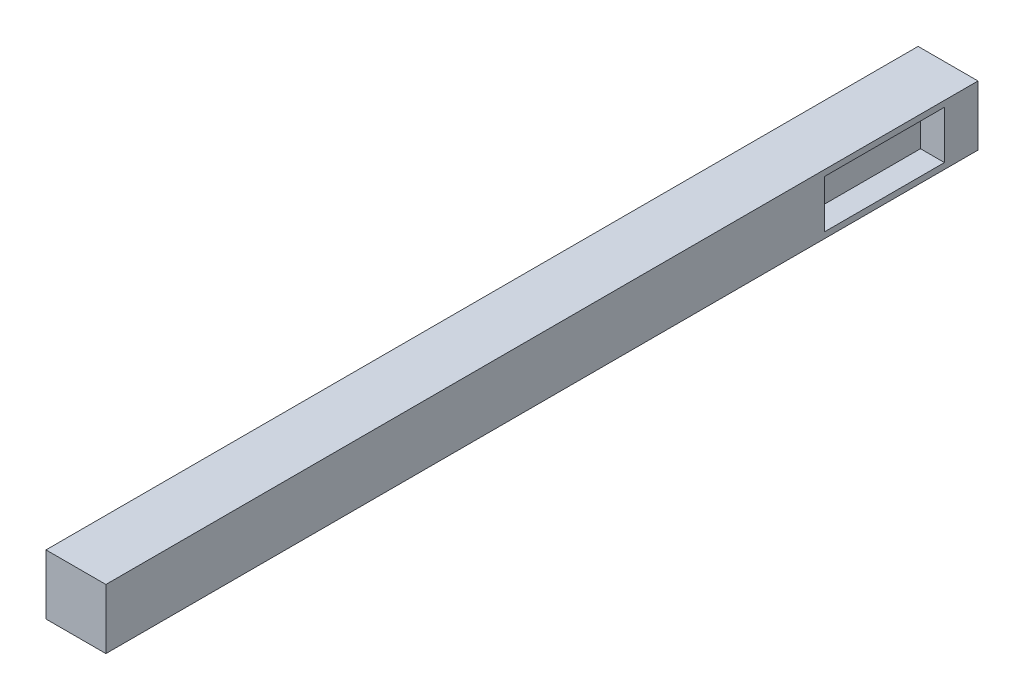
ISO-10303-21;
HEADER;
FILE_DESCRIPTION(('STEP AP214'),'2;1');
FILE_NAME('part.step','',(''),(''),'','','');
FILE_SCHEMA(('AUTOMOTIVE_DESIGN { 1 0 10303 214 1 1 1 1 }'));
ENDSEC;
DATA;
#1=APPLICATION_CONTEXT('core data for automotive mechanical design processes');
#2=APPLICATION_PROTOCOL_DEFINITION('international standard','automotive_design',2000,#1);
#3=PRODUCT_CONTEXT('',#1,'mechanical');
#4=PRODUCT('Part','Part','',(#3));
#5=PRODUCT_RELATED_PRODUCT_CATEGORY('part','',(#4));
#6=PRODUCT_DEFINITION_FORMATION('','',#4);
#7=PRODUCT_DEFINITION_CONTEXT('part definition',#1,'design');
#8=PRODUCT_DEFINITION('design','',#6,#7);
#9=PRODUCT_DEFINITION_SHAPE('','',#8);
#10=(LENGTH_UNIT() NAMED_UNIT(*) SI_UNIT(.MILLI.,.METRE.));
#11=(NAMED_UNIT(*) PLANE_ANGLE_UNIT() SI_UNIT($,.RADIAN.));
#12=(NAMED_UNIT(*) SI_UNIT($,.STERADIAN.) SOLID_ANGLE_UNIT());
#13=UNCERTAINTY_MEASURE_WITH_UNIT(LENGTH_MEASURE(1.E-05),#10,'distance_accuracy_value','');
#14=(GEOMETRIC_REPRESENTATION_CONTEXT(3) GLOBAL_UNCERTAINTY_ASSIGNED_CONTEXT((#13)) GLOBAL_UNIT_ASSIGNED_CONTEXT((#10,
#11,#12)) REPRESENTATION_CONTEXT('',''));
#15=CARTESIAN_POINT('',(0.,0.,0.));
#16=DIRECTION('',(0.,0.,1.));
#17=DIRECTION('',(1.,0.,0.));
#18=AXIS2_PLACEMENT_3D('',#15,#16,#17);
#19=CARTESIAN_POINT('',(12.5,12.5,364.));
#20=DIRECTION('',(-1.,0.,0.));
#21=DIRECTION('',(0.,-1.,0.));
#22=AXIS2_PLACEMENT_3D('',#19,#20,#21);
#23=PLANE('',#22);
#24=DIRECTION('',(0.,0.,-1.));
#25=VECTOR('',#24,1.);
#26=CARTESIAN_POINT('',(12.5,-10.,64.));
#27=LINE('',#26,#25);
#28=CARTESIAN_POINT('',(12.5,-10.,64.));
#29=VERTEX_POINT('',#28);
#30=CARTESIAN_POINT('',(12.5,-10.,14.));
#31=VERTEX_POINT('',#30);
#32=EDGE_CURVE('E139',#29,#31,#27,.T.);
#33=ORIENTED_EDGE('',*,*,#32,.F.);
#34=DIRECTION('',(0.,-1.,0.));
#35=VECTOR('',#34,1.);
#36=CARTESIAN_POINT('',(12.5,10.,64.));
#37=LINE('',#36,#35);
#38=CARTESIAN_POINT('',(12.5,10.,64.));
#39=VERTEX_POINT('',#38);
#40=EDGE_CURVE('E51',#39,#29,#37,.T.);
#41=ORIENTED_EDGE('',*,*,#40,.F.);
#42=DIRECTION('',(0.,0.,1.));
#43=VECTOR('',#42,1.);
#44=CARTESIAN_POINT('',(12.5,10.,64.));
#45=LINE('',#44,#43);
#46=CARTESIAN_POINT('',(12.5,10.,14.));
#47=VERTEX_POINT('',#46);
#48=EDGE_CURVE('E130',#47,#39,#45,.T.);
#49=ORIENTED_EDGE('',*,*,#48,.F.);
#50=DIRECTION('',(0.,1.,0.));
#51=VECTOR('',#50,1.);
#52=CARTESIAN_POINT('',(12.5,10.,14.));
#53=LINE('',#52,#51);
#54=EDGE_CURVE('E133',#31,#47,#53,.T.);
#55=ORIENTED_EDGE('',*,*,#54,.F.);
#56=EDGE_LOOP('',(#33,#41,#49,#55));
#57=FACE_BOUND('',#56,.T.);
#58=DIRECTION('',(0.,1.,0.));
#59=VECTOR('',#58,1.);
#60=CARTESIAN_POINT('',(12.5,12.5,0.));
#61=LINE('',#60,#59);
#62=CARTESIAN_POINT('',(12.5,-12.5,0.));
#63=VERTEX_POINT('',#62);
#64=CARTESIAN_POINT('',(12.5,12.5,0.));
#65=VERTEX_POINT('',#64);
#66=EDGE_CURVE('E145',#63,#65,#61,.T.);
#67=ORIENTED_EDGE('',*,*,#66,.T.);
#68=DIRECTION('',(0.,0.,-1.));
#69=VECTOR('',#68,1.);
#70=CARTESIAN_POINT('',(12.5,12.5,364.));
#71=LINE('',#70,#69);
#72=CARTESIAN_POINT('',(12.5,12.5,364.));
#73=VERTEX_POINT('',#72);
#74=EDGE_CURVE('E11',#73,#65,#71,.T.);
#75=ORIENTED_EDGE('',*,*,#74,.F.);
#76=DIRECTION('',(0.,1.,0.));
#77=VECTOR('',#76,1.);
#78=CARTESIAN_POINT('',(12.5,12.5,364.));
#79=LINE('',#78,#77);
#80=CARTESIAN_POINT('',(12.5,-12.5,364.));
#81=VERTEX_POINT('',#80);
#82=EDGE_CURVE('E149',#81,#73,#79,.T.);
#83=ORIENTED_EDGE('',*,*,#82,.F.);
#84=DIRECTION('',(0.,0.,-1.));
#85=VECTOR('',#84,1.);
#86=CARTESIAN_POINT('',(12.5,-12.5,364.));
#87=LINE('',#86,#85);
#88=EDGE_CURVE('E155',#81,#63,#87,.T.);
#89=ORIENTED_EDGE('',*,*,#88,.T.);
#90=EDGE_LOOP('',(#67,#75,#83,#89));
#91=FACE_BOUND('',#90,.T.);
#92=ADVANCED_FACE('F37',(#57,#91),#23,.F.);
#93=CARTESIAN_POINT('',(-12.5,12.5,364.));
#94=DIRECTION('',(0.,-1.,0.));
#95=DIRECTION('',(0.,0.,-1.));
#96=AXIS2_PLACEMENT_3D('',#93,#94,#95);
#97=PLANE('',#96);
#98=DIRECTION('',(-1.,0.,0.));
#99=VECTOR('',#98,1.);
#100=CARTESIAN_POINT('',(-12.5,12.5,0.));
#101=LINE('',#100,#99);
#102=CARTESIAN_POINT('',(-12.5,12.5,0.));
#103=VERTEX_POINT('',#102);
#104=EDGE_CURVE('E158',#65,#103,#101,.T.);
#105=ORIENTED_EDGE('',*,*,#104,.T.);
#106=DIRECTION('',(0.,0.,-1.));
#107=VECTOR('',#106,1.);
#108=CARTESIAN_POINT('',(-12.5,12.5,364.));
#109=LINE('',#108,#107);
#110=CARTESIAN_POINT('',(-12.5,12.5,364.));
#111=VERTEX_POINT('',#110);
#112=EDGE_CURVE('E44',#111,#103,#109,.T.);
#113=ORIENTED_EDGE('',*,*,#112,.F.);
#114=DIRECTION('',(-1.,0.,0.));
#115=VECTOR('',#114,1.);
#116=CARTESIAN_POINT('',(-12.5,12.5,364.));
#117=LINE('',#116,#115);
#118=EDGE_CURVE('E88',#73,#111,#117,.T.);
#119=ORIENTED_EDGE('',*,*,#118,.F.);
#120=ORIENTED_EDGE('',*,*,#74,.T.);
#121=EDGE_LOOP('',(#105,#113,#119,#120));
#122=FACE_BOUND('',#121,.T.);
#123=ADVANCED_FACE('F186',(#122),#97,.F.);
#124=CARTESIAN_POINT('',(-12.5,12.5,364.));
#125=DIRECTION('',(1.,0.,0.));
#126=DIRECTION('',(0.,1.,0.));
#127=AXIS2_PLACEMENT_3D('',#124,#125,#126);
#128=PLANE('',#127);
#129=DIRECTION('',(0.,-1.,0.));
#130=VECTOR('',#129,1.);
#131=CARTESIAN_POINT('',(-12.5,12.5,0.));
#132=LINE('',#131,#130);
#133=CARTESIAN_POINT('',(-12.5,-12.5,0.));
#134=VERTEX_POINT('',#133);
#135=EDGE_CURVE('E160',#103,#134,#132,.T.);
#136=ORIENTED_EDGE('',*,*,#135,.T.);
#137=DIRECTION('',(0.,0.,-1.));
#138=VECTOR('',#137,1.);
#139=CARTESIAN_POINT('',(-12.5,-12.5,364.));
#140=LINE('',#139,#138);
#141=CARTESIAN_POINT('',(-12.5,-12.5,364.));
#142=VERTEX_POINT('',#141);
#143=EDGE_CURVE('E164',#142,#134,#140,.T.);
#144=ORIENTED_EDGE('',*,*,#143,.F.);
#145=DIRECTION('',(0.,-1.,0.));
#146=VECTOR('',#145,1.);
#147=CARTESIAN_POINT('',(-12.5,12.5,364.));
#148=LINE('',#147,#146);
#149=EDGE_CURVE('E152',#111,#142,#148,.T.);
#150=ORIENTED_EDGE('',*,*,#149,.F.);
#151=ORIENTED_EDGE('',*,*,#112,.T.);
#152=EDGE_LOOP('',(#136,#144,#150,#151));
#153=FACE_BOUND('',#152,.T.);
#154=ADVANCED_FACE('F169',(#153),#128,.F.);
#155=CARTESIAN_POINT('',(-12.5,-12.5,364.));
#156=DIRECTION('',(0.,1.,0.));
#157=DIRECTION('',(0.,0.,1.));
#158=AXIS2_PLACEMENT_3D('',#155,#156,#157);
#159=PLANE('',#158);
#160=DIRECTION('',(1.,0.,0.));
#161=VECTOR('',#160,1.);
#162=CARTESIAN_POINT('',(-12.5,-12.5,0.));
#163=LINE('',#162,#161);
#164=EDGE_CURVE('E81',#134,#63,#163,.T.);
#165=ORIENTED_EDGE('',*,*,#164,.T.);
#166=ORIENTED_EDGE('',*,*,#88,.F.);
#167=DIRECTION('',(1.,0.,0.));
#168=VECTOR('',#167,1.);
#169=CARTESIAN_POINT('',(-12.5,-12.5,364.));
#170=LINE('',#169,#168);
#171=EDGE_CURVE('E60',#142,#81,#170,.T.);
#172=ORIENTED_EDGE('',*,*,#171,.F.);
#173=ORIENTED_EDGE('',*,*,#143,.T.);
#174=EDGE_LOOP('',(#165,#166,#172,#173));
#175=FACE_BOUND('',#174,.T.);
#176=ADVANCED_FACE('F177',(#175),#159,.F.);
#177=CARTESIAN_POINT('',(0.,0.,364.));
#178=DIRECTION('',(0.,0.,1.));
#179=DIRECTION('',(1.,0.,0.));
#180=AXIS2_PLACEMENT_3D('',#177,#178,#179);
#181=PLANE('',#180);
#182=ORIENTED_EDGE('',*,*,#82,.T.);
#183=ORIENTED_EDGE('',*,*,#118,.T.);
#184=ORIENTED_EDGE('',*,*,#149,.T.);
#185=ORIENTED_EDGE('',*,*,#171,.T.);
#186=EDGE_LOOP('',(#182,#183,#184,#185));
#187=FACE_BOUND('',#186,.T.);
#188=ADVANCED_FACE('F179',(#187),#181,.T.);
#189=CARTESIAN_POINT('',(0.,0.,0.));
#190=DIRECTION('',(0.,0.,1.));
#191=DIRECTION('',(1.,0.,0.));
#192=AXIS2_PLACEMENT_3D('',#189,#190,#191);
#193=PLANE('',#192);
#194=ORIENTED_EDGE('',*,*,#66,.F.);
#195=ORIENTED_EDGE('',*,*,#164,.F.);
#196=ORIENTED_EDGE('',*,*,#135,.F.);
#197=ORIENTED_EDGE('',*,*,#104,.F.);
#198=EDGE_LOOP('',(#194,#195,#196,#197));
#199=FACE_BOUND('',#198,.T.);
#200=ADVANCED_FACE('F173',(#199),#193,.F.);
#201=CARTESIAN_POINT('',(2.5,10.,64.));
#202=DIRECTION('',(0.,0.,1.));
#203=DIRECTION('',(1.,0.,0.));
#204=AXIS2_PLACEMENT_3D('',#201,#202,#203);
#205=PLANE('',#204);
#206=ORIENTED_EDGE('',*,*,#40,.T.);
#207=DIRECTION('',(1.,0.,0.));
#208=VECTOR('',#207,1.);
#209=CARTESIAN_POINT('',(2.5,-10.,64.));
#210=LINE('',#209,#208);
#211=CARTESIAN_POINT('',(2.5,-10.,64.));
#212=VERTEX_POINT('',#211);
#213=EDGE_CURVE('E108',#212,#29,#210,.T.);
#214=ORIENTED_EDGE('',*,*,#213,.F.);
#215=DIRECTION('',(0.,-1.,0.));
#216=VECTOR('',#215,1.);
#217=CARTESIAN_POINT('',(2.5,10.,64.));
#218=LINE('',#217,#216);
#219=CARTESIAN_POINT('',(2.5,10.,64.));
#220=VERTEX_POINT('',#219);
#221=EDGE_CURVE('E112',#220,#212,#218,.T.);
#222=ORIENTED_EDGE('',*,*,#221,.F.);
#223=DIRECTION('',(1.,0.,0.));
#224=VECTOR('',#223,1.);
#225=CARTESIAN_POINT('',(2.5,10.,64.));
#226=LINE('',#225,#224);
#227=EDGE_CURVE('E143',#220,#39,#226,.T.);
#228=ORIENTED_EDGE('',*,*,#227,.T.);
#229=EDGE_LOOP('',(#206,#214,#222,#228));
#230=FACE_BOUND('',#229,.T.);
#231=ADVANCED_FACE('F110',(#230),#205,.F.);
#232=CARTESIAN_POINT('',(2.5,10.,64.));
#233=DIRECTION('',(0.,1.,0.));
#234=DIRECTION('',(-1.,0.,0.));
#235=AXIS2_PLACEMENT_3D('',#232,#233,#234);
#236=PLANE('',#235);
#237=ORIENTED_EDGE('',*,*,#48,.T.);
#238=ORIENTED_EDGE('',*,*,#227,.F.);
#239=DIRECTION('',(0.,0.,1.));
#240=VECTOR('',#239,1.);
#241=CARTESIAN_POINT('',(2.5,10.,64.));
#242=LINE('',#241,#240);
#243=CARTESIAN_POINT('',(2.5,10.,14.));
#244=VERTEX_POINT('',#243);
#245=EDGE_CURVE('E118',#244,#220,#242,.T.);
#246=ORIENTED_EDGE('',*,*,#245,.F.);
#247=DIRECTION('',(1.,0.,0.));
#248=VECTOR('',#247,1.);
#249=CARTESIAN_POINT('',(2.5,10.,14.));
#250=LINE('',#249,#248);
#251=EDGE_CURVE('E146',#244,#47,#250,.T.);
#252=ORIENTED_EDGE('',*,*,#251,.T.);
#253=EDGE_LOOP('',(#237,#238,#246,#252));
#254=FACE_BOUND('',#253,.T.);
#255=ADVANCED_FACE('F199',(#254),#236,.F.);
#256=CARTESIAN_POINT('',(2.5,10.,14.));
#257=DIRECTION('',(0.,0.,-1.));
#258=DIRECTION('',(-1.,0.,0.));
#259=AXIS2_PLACEMENT_3D('',#256,#257,#258);
#260=PLANE('',#259);
#261=ORIENTED_EDGE('',*,*,#54,.T.);
#262=ORIENTED_EDGE('',*,*,#251,.F.);
#263=DIRECTION('',(0.,1.,0.));
#264=VECTOR('',#263,1.);
#265=CARTESIAN_POINT('',(2.5,10.,14.));
#266=LINE('',#265,#264);
#267=CARTESIAN_POINT('',(2.5,-10.,14.));
#268=VERTEX_POINT('',#267);
#269=EDGE_CURVE('E126',#268,#244,#266,.T.);
#270=ORIENTED_EDGE('',*,*,#269,.F.);
#271=DIRECTION('',(1.,0.,0.));
#272=VECTOR('',#271,1.);
#273=CARTESIAN_POINT('',(2.5,-10.,14.));
#274=LINE('',#273,#272);
#275=EDGE_CURVE('E117',#268,#31,#274,.T.);
#276=ORIENTED_EDGE('',*,*,#275,.T.);
#277=EDGE_LOOP('',(#261,#262,#270,#276));
#278=FACE_BOUND('',#277,.T.);
#279=ADVANCED_FACE('F197',(#278),#260,.F.);
#280=CARTESIAN_POINT('',(2.5,-10.,64.));
#281=DIRECTION('',(0.,-1.,0.));
#282=DIRECTION('',(1.,0.,0.));
#283=AXIS2_PLACEMENT_3D('',#280,#281,#282);
#284=PLANE('',#283);
#285=ORIENTED_EDGE('',*,*,#32,.T.);
#286=ORIENTED_EDGE('',*,*,#275,.F.);
#287=DIRECTION('',(0.,0.,-1.));
#288=VECTOR('',#287,1.);
#289=CARTESIAN_POINT('',(2.5,-10.,64.));
#290=LINE('',#289,#288);
#291=EDGE_CURVE('E121',#212,#268,#290,.T.);
#292=ORIENTED_EDGE('',*,*,#291,.F.);
#293=ORIENTED_EDGE('',*,*,#213,.T.);
#294=EDGE_LOOP('',(#285,#286,#292,#293));
#295=FACE_BOUND('',#294,.T.);
#296=ADVANCED_FACE('F122',(#295),#284,.F.);
#297=CARTESIAN_POINT('',(2.5,0.,0.));
#298=DIRECTION('',(1.,0.,0.));
#299=DIRECTION('',(0.,1.,0.));
#300=AXIS2_PLACEMENT_3D('',#297,#298,#299);
#301=PLANE('',#300);
#302=ORIENTED_EDGE('',*,*,#221,.T.);
#303=ORIENTED_EDGE('',*,*,#291,.T.);
#304=ORIENTED_EDGE('',*,*,#269,.T.);
#305=ORIENTED_EDGE('',*,*,#245,.T.);
#306=EDGE_LOOP('',(#302,#303,#304,#305));
#307=FACE_BOUND('',#306,.T.);
#308=ADVANCED_FACE('F128',(#307),#301,.T.);
#309=CLOSED_SHELL('',(#92,#123,#154,#176,#188,#200,#231,#255,#279,#296,#308));
#310=MANIFOLD_SOLID_BREP('B2',#309);
#311=ADVANCED_BREP_SHAPE_REPRESENTATION('',(#18,#310),#14);
#312=SHAPE_DEFINITION_REPRESENTATION(#9,#311);
ENDSEC;
END-ISO-10303-21;
